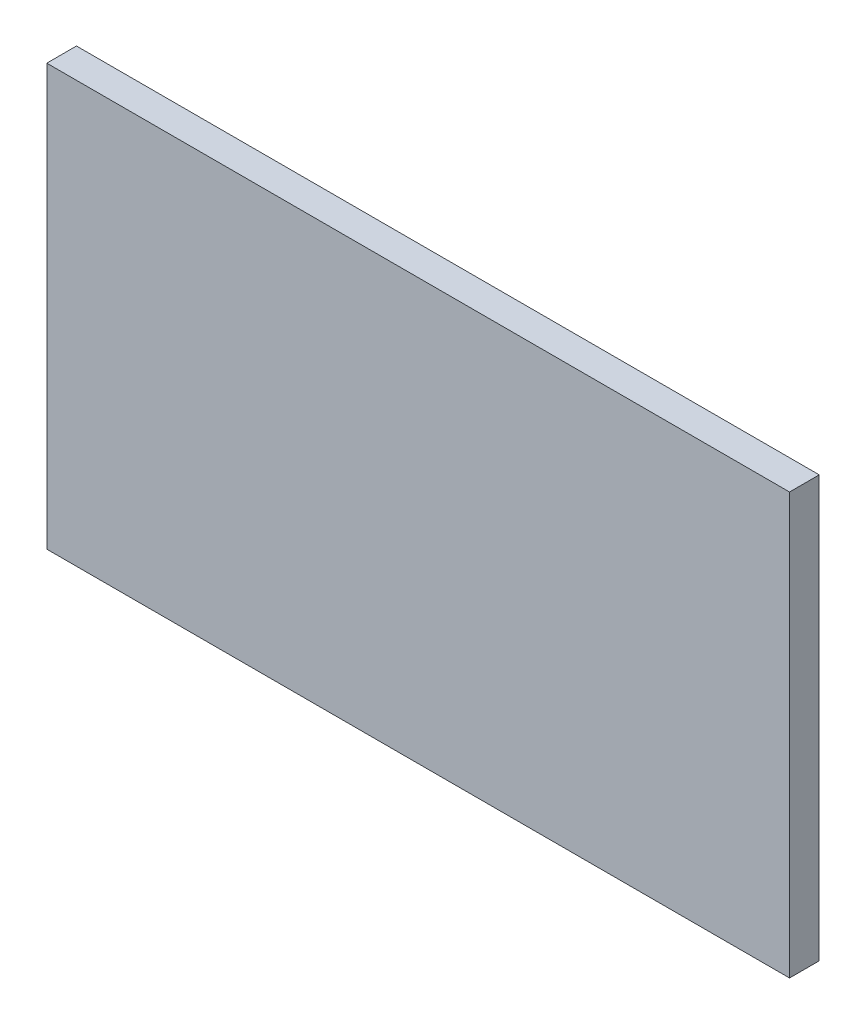
ISO-10303-21;
HEADER;
FILE_DESCRIPTION(('STEP AP214'),'2;1');
FILE_NAME('part.step','',(''),(''),'','','');
FILE_SCHEMA(('AUTOMOTIVE_DESIGN { 1 0 10303 214 1 1 1 1 }'));
ENDSEC;
DATA;
#1=APPLICATION_CONTEXT('core data for automotive mechanical design processes');
#2=APPLICATION_PROTOCOL_DEFINITION('international standard','automotive_design',2000,#1);
#3=PRODUCT_CONTEXT('',#1,'mechanical');
#4=PRODUCT('Part','Part','',(#3));
#5=PRODUCT_RELATED_PRODUCT_CATEGORY('part','',(#4));
#6=PRODUCT_DEFINITION_FORMATION('','',#4);
#7=PRODUCT_DEFINITION_CONTEXT('part definition',#1,'design');
#8=PRODUCT_DEFINITION('design','',#6,#7);
#9=PRODUCT_DEFINITION_SHAPE('','',#8);
#10=(LENGTH_UNIT() NAMED_UNIT(*) SI_UNIT(.MILLI.,.METRE.));
#11=(NAMED_UNIT(*) PLANE_ANGLE_UNIT() SI_UNIT($,.RADIAN.));
#12=(NAMED_UNIT(*) SI_UNIT($,.STERADIAN.) SOLID_ANGLE_UNIT());
#13=UNCERTAINTY_MEASURE_WITH_UNIT(LENGTH_MEASURE(1.E-05),#10,'distance_accuracy_value','');
#14=(GEOMETRIC_REPRESENTATION_CONTEXT(3) GLOBAL_UNCERTAINTY_ASSIGNED_CONTEXT((#13)) GLOBAL_UNIT_ASSIGNED_CONTEXT((#10,
#11,#12)) REPRESENTATION_CONTEXT('',''));
#15=CARTESIAN_POINT('',(0.,0.,0.));
#16=DIRECTION('',(0.,0.,1.));
#17=DIRECTION('',(1.,0.,0.));
#18=AXIS2_PLACEMENT_3D('',#15,#16,#17);
#19=CARTESIAN_POINT('',(750.,-425.,60.));
#20=DIRECTION('',(-1.,0.,0.));
#21=DIRECTION('',(0.,0.,1.));
#22=AXIS2_PLACEMENT_3D('',#19,#20,#21);
#23=PLANE('',#22);
#24=DIRECTION('',(0.,1.,0.));
#25=VECTOR('',#24,1.);
#26=CARTESIAN_POINT('',(750.,-425.,0.));
#27=LINE('',#26,#25);
#28=CARTESIAN_POINT('',(750.,-425.,0.));
#29=VERTEX_POINT('',#28);
#30=CARTESIAN_POINT('',(750.,425.,0.));
#31=VERTEX_POINT('',#30);
#32=EDGE_CURVE('E113',#29,#31,#27,.T.);
#33=ORIENTED_EDGE('',*,*,#32,.T.);
#34=DIRECTION('',(0.,0.,-1.));
#35=VECTOR('',#34,1.);
#36=CARTESIAN_POINT('',(750.,425.,60.));
#37=LINE('',#36,#35);
#38=CARTESIAN_POINT('',(750.,425.,60.));
#39=VERTEX_POINT('',#38);
#40=EDGE_CURVE('E11',#39,#31,#37,.T.);
#41=ORIENTED_EDGE('',*,*,#40,.F.);
#42=DIRECTION('',(0.,1.,0.));
#43=VECTOR('',#42,1.);
#44=CARTESIAN_POINT('',(750.,-425.,60.));
#45=LINE('',#44,#43);
#46=CARTESIAN_POINT('',(750.,-425.,60.));
#47=VERTEX_POINT('',#46);
#48=EDGE_CURVE('E97',#47,#39,#45,.T.);
#49=ORIENTED_EDGE('',*,*,#48,.F.);
#50=DIRECTION('',(0.,0.,-1.));
#51=VECTOR('',#50,1.);
#52=CARTESIAN_POINT('',(750.,-425.,60.));
#53=LINE('',#52,#51);
#54=EDGE_CURVE('E109',#47,#29,#53,.T.);
#55=ORIENTED_EDGE('',*,*,#54,.T.);
#56=EDGE_LOOP('',(#33,#41,#49,#55));
#57=FACE_BOUND('',#56,.T.);
#58=ADVANCED_FACE('F45',(#57),#23,.F.);
#59=CARTESIAN_POINT('',(-750.,425.,60.));
#60=DIRECTION('',(0.,-1.,0.));
#61=DIRECTION('',(0.,0.,-1.));
#62=AXIS2_PLACEMENT_3D('',#59,#60,#61);
#63=PLANE('',#62);
#64=DIRECTION('',(-1.,0.,0.));
#65=VECTOR('',#64,1.);
#66=CARTESIAN_POINT('',(-750.,425.,0.));
#67=LINE('',#66,#65);
#68=CARTESIAN_POINT('',(-750.,425.,0.));
#69=VERTEX_POINT('',#68);
#70=EDGE_CURVE('E102',#31,#69,#67,.T.);
#71=ORIENTED_EDGE('',*,*,#70,.T.);
#72=DIRECTION('',(0.,0.,-1.));
#73=VECTOR('',#72,1.);
#74=CARTESIAN_POINT('',(-750.,425.,60.));
#75=LINE('',#74,#73);
#76=CARTESIAN_POINT('',(-750.,425.,60.));
#77=VERTEX_POINT('',#76);
#78=EDGE_CURVE('E54',#77,#69,#75,.T.);
#79=ORIENTED_EDGE('',*,*,#78,.F.);
#80=DIRECTION('',(-1.,0.,0.));
#81=VECTOR('',#80,1.);
#82=CARTESIAN_POINT('',(-750.,425.,60.));
#83=LINE('',#82,#81);
#84=EDGE_CURVE('E92',#39,#77,#83,.T.);
#85=ORIENTED_EDGE('',*,*,#84,.F.);
#86=ORIENTED_EDGE('',*,*,#40,.T.);
#87=EDGE_LOOP('',(#71,#79,#85,#86));
#88=FACE_BOUND('',#87,.T.);
#89=ADVANCED_FACE('F101',(#88),#63,.F.);
#90=CARTESIAN_POINT('',(-750.,-425.,60.));
#91=DIRECTION('',(1.,0.,0.));
#92=DIRECTION('',(0.,0.,-1.));
#93=AXIS2_PLACEMENT_3D('',#90,#91,#92);
#94=PLANE('',#93);
#95=DIRECTION('',(0.,-1.,0.));
#96=VECTOR('',#95,1.);
#97=CARTESIAN_POINT('',(-750.,-425.,0.));
#98=LINE('',#97,#96);
#99=CARTESIAN_POINT('',(-750.,-425.,0.));
#100=VERTEX_POINT('',#99);
#101=EDGE_CURVE('E79',#69,#100,#98,.T.);
#102=ORIENTED_EDGE('',*,*,#101,.T.);
#103=DIRECTION('',(0.,0.,-1.));
#104=VECTOR('',#103,1.);
#105=CARTESIAN_POINT('',(-750.,-425.,60.));
#106=LINE('',#105,#104);
#107=CARTESIAN_POINT('',(-750.,-425.,60.));
#108=VERTEX_POINT('',#107);
#109=EDGE_CURVE('E104',#108,#100,#106,.T.);
#110=ORIENTED_EDGE('',*,*,#109,.F.);
#111=DIRECTION('',(0.,-1.,0.));
#112=VECTOR('',#111,1.);
#113=CARTESIAN_POINT('',(-750.,-425.,60.));
#114=LINE('',#113,#112);
#115=EDGE_CURVE('E95',#77,#108,#114,.T.);
#116=ORIENTED_EDGE('',*,*,#115,.F.);
#117=ORIENTED_EDGE('',*,*,#78,.T.);
#118=EDGE_LOOP('',(#102,#110,#116,#117));
#119=FACE_BOUND('',#118,.T.);
#120=ADVANCED_FACE('F105',(#119),#94,.F.);
#121=CARTESIAN_POINT('',(-750.,-425.,60.));
#122=DIRECTION('',(0.,1.,0.));
#123=DIRECTION('',(0.,0.,1.));
#124=AXIS2_PLACEMENT_3D('',#121,#122,#123);
#125=PLANE('',#124);
#126=DIRECTION('',(1.,0.,0.));
#127=VECTOR('',#126,1.);
#128=CARTESIAN_POINT('',(-750.,-425.,0.));
#129=LINE('',#128,#127);
#130=EDGE_CURVE('E85',#100,#29,#129,.T.);
#131=ORIENTED_EDGE('',*,*,#130,.T.);
#132=ORIENTED_EDGE('',*,*,#54,.F.);
#133=DIRECTION('',(1.,0.,0.));
#134=VECTOR('',#133,1.);
#135=CARTESIAN_POINT('',(-750.,-425.,60.));
#136=LINE('',#135,#134);
#137=EDGE_CURVE('E62',#108,#47,#136,.T.);
#138=ORIENTED_EDGE('',*,*,#137,.F.);
#139=ORIENTED_EDGE('',*,*,#109,.T.);
#140=EDGE_LOOP('',(#131,#132,#138,#139));
#141=FACE_BOUND('',#140,.T.);
#142=ADVANCED_FACE('F126',(#141),#125,.F.);
#143=CARTESIAN_POINT('',(0.,0.,60.));
#144=DIRECTION('',(0.,0.,-1.));
#145=DIRECTION('',(-1.,0.,0.));
#146=AXIS2_PLACEMENT_3D('',#143,#144,#145);
#147=PLANE('',#146);
#148=ORIENTED_EDGE('',*,*,#48,.T.);
#149=ORIENTED_EDGE('',*,*,#84,.T.);
#150=ORIENTED_EDGE('',*,*,#115,.T.);
#151=ORIENTED_EDGE('',*,*,#137,.T.);
#152=EDGE_LOOP('',(#148,#149,#150,#151));
#153=FACE_BOUND('',#152,.T.);
#154=ADVANCED_FACE('F93',(#153),#147,.F.);
#155=CARTESIAN_POINT('',(0.,0.,0.));
#156=DIRECTION('',(0.,0.,-1.));
#157=DIRECTION('',(-1.,0.,0.));
#158=AXIS2_PLACEMENT_3D('',#155,#156,#157);
#159=PLANE('',#158);
#160=ORIENTED_EDGE('',*,*,#32,.F.);
#161=ORIENTED_EDGE('',*,*,#130,.F.);
#162=ORIENTED_EDGE('',*,*,#101,.F.);
#163=ORIENTED_EDGE('',*,*,#70,.F.);
#164=EDGE_LOOP('',(#160,#161,#162,#163));
#165=FACE_BOUND('',#164,.T.);
#166=ADVANCED_FACE('F129',(#165),#159,.T.);
#167=CLOSED_SHELL('',(#58,#89,#120,#142,#154,#166));
#168=MANIFOLD_SOLID_BREP('B2',#167);
#169=ADVANCED_BREP_SHAPE_REPRESENTATION('',(#18,#168),#14);
#170=SHAPE_DEFINITION_REPRESENTATION(#9,#169);
ENDSEC;
END-ISO-10303-21;
